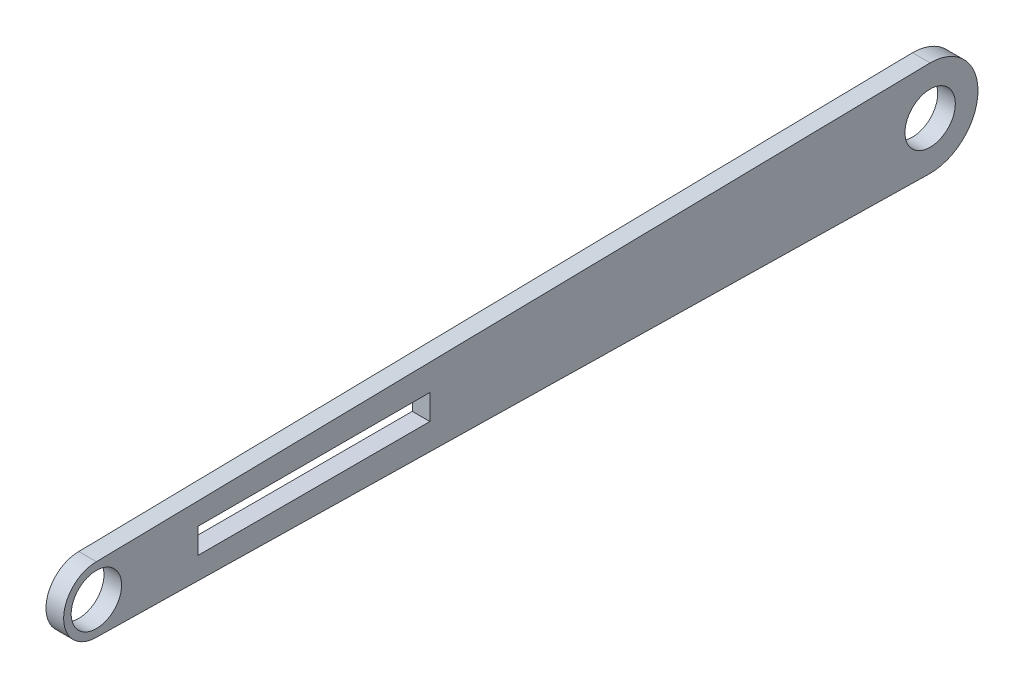
ISO-10303-21;
HEADER;
FILE_DESCRIPTION(('STEP AP214'),'2;1');
FILE_NAME('part.step','',(''),(''),'','','');
FILE_SCHEMA(('AUTOMOTIVE_DESIGN { 1 0 10303 214 1 1 1 1 }'));
ENDSEC;
DATA;
#1=APPLICATION_CONTEXT('core data for automotive mechanical design processes');
#2=APPLICATION_PROTOCOL_DEFINITION('international standard','automotive_design',2000,#1);
#3=PRODUCT_CONTEXT('',#1,'mechanical');
#4=PRODUCT('Part','Part','',(#3));
#5=PRODUCT_RELATED_PRODUCT_CATEGORY('part','',(#4));
#6=PRODUCT_DEFINITION_FORMATION('','',#4);
#7=PRODUCT_DEFINITION_CONTEXT('part definition',#1,'design');
#8=PRODUCT_DEFINITION('design','',#6,#7);
#9=PRODUCT_DEFINITION_SHAPE('','',#8);
#10=(LENGTH_UNIT() NAMED_UNIT(*) SI_UNIT(.MILLI.,.METRE.));
#11=(NAMED_UNIT(*) PLANE_ANGLE_UNIT() SI_UNIT($,.RADIAN.));
#12=(NAMED_UNIT(*) SI_UNIT($,.STERADIAN.) SOLID_ANGLE_UNIT());
#13=UNCERTAINTY_MEASURE_WITH_UNIT(LENGTH_MEASURE(1.E-05),#10,'distance_accuracy_value','');
#14=(GEOMETRIC_REPRESENTATION_CONTEXT(3) GLOBAL_UNCERTAINTY_ASSIGNED_CONTEXT((#13)) GLOBAL_UNIT_ASSIGNED_CONTEXT((#10,
#11,#12)) REPRESENTATION_CONTEXT('',''));
#15=CARTESIAN_POINT('',(0.,0.,0.));
#16=DIRECTION('',(0.,0.,1.));
#17=DIRECTION('',(1.,0.,0.));
#18=AXIS2_PLACEMENT_3D('',#15,#16,#17);
#19=CARTESIAN_POINT('',(0.35,-0.649786490506127,0.0117786070786609));
#20=DIRECTION('',(0.,-0.999835748438502,0.0181239108478279));
#21=DIRECTION('',(0.,-0.0181239108478279,-0.999835748438502));
#22=AXIS2_PLACEMENT_3D('',#19,#20,#21);
#23=PLANE('',#22);
#24=DIRECTION('',(0.,0.0181239108478279,0.999835748438502));
#25=VECTOR('',#24,1.);
#26=CARTESIAN_POINT('',(0.,-0.649786490506127,0.0117786070786609));
#27=LINE('',#26,#25);
#28=CARTESIAN_POINT('',(0.,-0.950000000000001,-16.55));
#29=VERTEX_POINT('',#28);
#30=CARTESIAN_POINT('',(0.,-0.65,0.));
#31=VERTEX_POINT('',#30);
#32=EDGE_CURVE('E148',#29,#31,#27,.T.);
#33=ORIENTED_EDGE('',*,*,#32,.F.);
#34=DIRECTION('',(-1.,0.,0.));
#35=VECTOR('',#34,1.);
#36=CARTESIAN_POINT('',(0.35,-0.950000000000001,-16.55));
#37=LINE('',#36,#35);
#38=CARTESIAN_POINT('',(0.35,-0.950000000000001,-16.55));
#39=VERTEX_POINT('',#38);
#40=EDGE_CURVE('E11',#39,#29,#37,.T.);
#41=ORIENTED_EDGE('',*,*,#40,.F.);
#42=DIRECTION('',(0.,0.0181239108478279,0.999835748438502));
#43=VECTOR('',#42,1.);
#44=CARTESIAN_POINT('',(0.35,-0.649786490506127,0.0117786070786609));
#45=LINE('',#44,#43);
#46=CARTESIAN_POINT('',(0.35,-0.65,0.));
#47=VERTEX_POINT('',#46);
#48=EDGE_CURVE('E113',#39,#47,#45,.T.);
#49=ORIENTED_EDGE('',*,*,#48,.T.);
#50=DIRECTION('',(-1.,0.,0.));
#51=VECTOR('',#50,1.);
#52=CARTESIAN_POINT('',(0.35,-0.65,0.));
#53=LINE('',#52,#51);
#54=EDGE_CURVE('E86',#47,#31,#53,.T.);
#55=ORIENTED_EDGE('',*,*,#54,.T.);
#56=EDGE_LOOP('',(#33,#41,#49,#55));
#57=FACE_BOUND('',#56,.T.);
#58=ADVANCED_FACE('F33',(#57),#23,.T.);
#59=CARTESIAN_POINT('',(0.35,0.,-16.55));
#60=DIRECTION('',(-1.,0.,0.));
#61=DIRECTION('',(0.,0.,1.));
#62=AXIS2_PLACEMENT_3D('',#59,#60,#61);
#63=CYLINDRICAL_SURFACE('',#62,0.950000000000001);
#64=CARTESIAN_POINT('',(0.,0.,-16.55));
#65=DIRECTION('',(1.,0.,0.));
#66=DIRECTION('',(0.,0.,-1.));
#67=AXIS2_PLACEMENT_3D('',#64,#65,#66);
#68=CIRCLE('',#67,0.950000000000001);
#69=CARTESIAN_POINT('',(0.,0.950000000000001,-16.55));
#70=VERTEX_POINT('',#69);
#71=EDGE_CURVE('E119',#29,#70,#68,.T.);
#72=ORIENTED_EDGE('',*,*,#71,.T.);
#73=DIRECTION('',(-1.,0.,0.));
#74=VECTOR('',#73,1.);
#75=CARTESIAN_POINT('',(0.35,0.950000000000001,-16.55));
#76=LINE('',#75,#74);
#77=CARTESIAN_POINT('',(0.35,0.950000000000001,-16.55));
#78=VERTEX_POINT('',#77);
#79=EDGE_CURVE('E43',#78,#70,#76,.T.);
#80=ORIENTED_EDGE('',*,*,#79,.F.);
#81=CARTESIAN_POINT('',(0.35,0.,-16.55));
#82=DIRECTION('',(1.,0.,0.));
#83=DIRECTION('',(0.,0.,-1.));
#84=AXIS2_PLACEMENT_3D('',#81,#82,#83);
#85=CIRCLE('',#84,0.950000000000001);
#86=EDGE_CURVE('E108',#39,#78,#85,.T.);
#87=ORIENTED_EDGE('',*,*,#86,.F.);
#88=ORIENTED_EDGE('',*,*,#40,.T.);
#89=EDGE_LOOP('',(#72,#80,#87,#88));
#90=FACE_BOUND('',#89,.T.);
#91=ADVANCED_FACE('F117',(#90),#63,.T.);
#92=CARTESIAN_POINT('',(0.35,0.649786490506127,0.0117786070786609));
#93=DIRECTION('',(0.,0.999835748438502,0.0181239108478279));
#94=DIRECTION('',(0.,-0.0181239108478279,0.999835748438502));
#95=AXIS2_PLACEMENT_3D('',#92,#93,#94);
#96=PLANE('',#95);
#97=DIRECTION('',(0.,0.0181239108478279,-0.999835748438502));
#98=VECTOR('',#97,1.);
#99=CARTESIAN_POINT('',(0.,0.649786490506127,0.0117786070786609));
#100=LINE('',#99,#98);
#101=CARTESIAN_POINT('',(0.,0.65,0.));
#102=VERTEX_POINT('',#101);
#103=EDGE_CURVE('E152',#102,#70,#100,.T.);
#104=ORIENTED_EDGE('',*,*,#103,.F.);
#105=DIRECTION('',(-1.,0.,0.));
#106=VECTOR('',#105,1.);
#107=CARTESIAN_POINT('',(0.35,0.65,0.));
#108=LINE('',#107,#106);
#109=CARTESIAN_POINT('',(0.35,0.65,0.));
#110=VERTEX_POINT('',#109);
#111=EDGE_CURVE('E79',#110,#102,#108,.T.);
#112=ORIENTED_EDGE('',*,*,#111,.F.);
#113=DIRECTION('',(0.,0.0181239108478279,-0.999835748438502));
#114=VECTOR('',#113,1.);
#115=CARTESIAN_POINT('',(0.35,0.649786490506127,0.0117786070786609));
#116=LINE('',#115,#114);
#117=EDGE_CURVE('E112',#110,#78,#116,.T.);
#118=ORIENTED_EDGE('',*,*,#117,.T.);
#119=ORIENTED_EDGE('',*,*,#79,.T.);
#120=EDGE_LOOP('',(#104,#112,#118,#119));
#121=FACE_BOUND('',#120,.T.);
#122=ADVANCED_FACE('F124',(#121),#96,.T.);
#123=CARTESIAN_POINT('',(0.35,0.25,0.));
#124=DIRECTION('',(0.,1.,0.));
#125=DIRECTION('',(0.,0.,1.));
#126=AXIS2_PLACEMENT_3D('',#123,#124,#125);
#127=PLANE('',#126);
#128=DIRECTION('',(0.,0.,-1.));
#129=VECTOR('',#128,1.);
#130=CARTESIAN_POINT('',(0.,0.25,0.));
#131=LINE('',#130,#129);
#132=CARTESIAN_POINT('',(0.,0.25,-2.02));
#133=VERTEX_POINT('',#132);
#134=CARTESIAN_POINT('',(0.,0.25,-6.62));
#135=VERTEX_POINT('',#134);
#136=EDGE_CURVE('E130',#133,#135,#131,.T.);
#137=ORIENTED_EDGE('',*,*,#136,.T.);
#138=DIRECTION('',(-1.,0.,0.));
#139=VECTOR('',#138,1.);
#140=CARTESIAN_POINT('',(0.35,0.25,-6.62));
#141=LINE('',#140,#139);
#142=CARTESIAN_POINT('',(0.35,0.25,-6.62));
#143=VERTEX_POINT('',#142);
#144=EDGE_CURVE('E37',#143,#135,#141,.T.);
#145=ORIENTED_EDGE('',*,*,#144,.F.);
#146=DIRECTION('',(0.,0.,-1.));
#147=VECTOR('',#146,1.);
#148=CARTESIAN_POINT('',(0.35,0.25,0.));
#149=LINE('',#148,#147);
#150=CARTESIAN_POINT('',(0.35,0.25,-2.02));
#151=VERTEX_POINT('',#150);
#152=EDGE_CURVE('E156',#151,#143,#149,.T.);
#153=ORIENTED_EDGE('',*,*,#152,.F.);
#154=DIRECTION('',(-1.,0.,0.));
#155=VECTOR('',#154,1.);
#156=CARTESIAN_POINT('',(0.35,0.25,-2.02));
#157=LINE('',#156,#155);
#158=EDGE_CURVE('E126',#151,#133,#157,.T.);
#159=ORIENTED_EDGE('',*,*,#158,.T.);
#160=EDGE_LOOP('',(#137,#145,#153,#159));
#161=FACE_BOUND('',#160,.T.);
#162=ADVANCED_FACE('F35',(#161),#127,.F.);
#163=CARTESIAN_POINT('',(0.35,0.,-6.62));
#164=DIRECTION('',(0.,0.,-1.));
#165=DIRECTION('',(-1.,0.,0.));
#166=AXIS2_PLACEMENT_3D('',#163,#164,#165);
#167=PLANE('',#166);
#168=DIRECTION('',(0.,-1.,0.));
#169=VECTOR('',#168,1.);
#170=CARTESIAN_POINT('',(0.,0.,-6.62));
#171=LINE('',#170,#169);
#172=CARTESIAN_POINT('',(0.,-0.25,-6.62));
#173=VERTEX_POINT('',#172);
#174=EDGE_CURVE('E133',#135,#173,#171,.T.);
#175=ORIENTED_EDGE('',*,*,#174,.T.);
#176=DIRECTION('',(-1.,0.,0.));
#177=VECTOR('',#176,1.);
#178=CARTESIAN_POINT('',(0.35,-0.25,-6.62));
#179=LINE('',#178,#177);
#180=CARTESIAN_POINT('',(0.35,-0.25,-6.62));
#181=VERTEX_POINT('',#180);
#182=EDGE_CURVE('E161',#181,#173,#179,.T.);
#183=ORIENTED_EDGE('',*,*,#182,.F.);
#184=DIRECTION('',(0.,-1.,0.));
#185=VECTOR('',#184,1.);
#186=CARTESIAN_POINT('',(0.35,0.,-6.62));
#187=LINE('',#186,#185);
#188=EDGE_CURVE('E94',#143,#181,#187,.T.);
#189=ORIENTED_EDGE('',*,*,#188,.F.);
#190=ORIENTED_EDGE('',*,*,#144,.T.);
#191=EDGE_LOOP('',(#175,#183,#189,#190));
#192=FACE_BOUND('',#191,.T.);
#193=ADVANCED_FACE('F166',(#192),#167,.F.);
#194=CARTESIAN_POINT('',(0.35,-0.25,0.));
#195=DIRECTION('',(0.,1.,0.));
#196=DIRECTION('',(0.,0.,1.));
#197=AXIS2_PLACEMENT_3D('',#194,#195,#196);
#198=PLANE('',#197);
#199=DIRECTION('',(0.,0.,-1.));
#200=VECTOR('',#199,1.);
#201=CARTESIAN_POINT('',(0.,-0.25,0.));
#202=LINE('',#201,#200);
#203=CARTESIAN_POINT('',(0.,-0.25,-2.02));
#204=VERTEX_POINT('',#203);
#205=EDGE_CURVE('E136',#204,#173,#202,.T.);
#206=ORIENTED_EDGE('',*,*,#205,.F.);
#207=DIRECTION('',(-1.,0.,0.));
#208=VECTOR('',#207,1.);
#209=CARTESIAN_POINT('',(0.35,-0.25,-2.02));
#210=LINE('',#209,#208);
#211=CARTESIAN_POINT('',(0.35,-0.25,-2.02));
#212=VERTEX_POINT('',#211);
#213=EDGE_CURVE('E160',#212,#204,#210,.T.);
#214=ORIENTED_EDGE('',*,*,#213,.F.);
#215=DIRECTION('',(0.,0.,-1.));
#216=VECTOR('',#215,1.);
#217=CARTESIAN_POINT('',(0.35,-0.25,0.));
#218=LINE('',#217,#216);
#219=EDGE_CURVE('E290',#212,#181,#218,.T.);
#220=ORIENTED_EDGE('',*,*,#219,.T.);
#221=ORIENTED_EDGE('',*,*,#182,.T.);
#222=EDGE_LOOP('',(#206,#214,#220,#221));
#223=FACE_BOUND('',#222,.T.);
#224=ADVANCED_FACE('F180',(#223),#198,.T.);
#225=CARTESIAN_POINT('',(0.35,0.,-16.55));
#226=DIRECTION('',(-1.,0.,0.));
#227=DIRECTION('',(0.,0.,1.));
#228=AXIS2_PLACEMENT_3D('',#225,#226,#227);
#229=CYLINDRICAL_SURFACE('',#228,0.499999999999999);
#230=CARTESIAN_POINT('',(0.35,0.,-16.55));
#231=DIRECTION('',(1.,0.,0.));
#232=DIRECTION('',(0.,0.,-1.));
#233=AXIS2_PLACEMENT_3D('',#230,#231,#232);
#234=CIRCLE('',#233,0.499999999999999);
#235=CARTESIAN_POINT('',(0.35,0.,-17.05));
#236=VERTEX_POINT('',#235);
#237=EDGE_CURVE('E282',#236,#236,#234,.T.);
#238=ORIENTED_EDGE('',*,*,#237,.T.);
#239=EDGE_LOOP('',(#238));
#240=FACE_BOUND('',#239,.T.);
#241=CARTESIAN_POINT('',(0.,0.,-16.55));
#242=DIRECTION('',(1.,0.,0.));
#243=DIRECTION('',(0.,0.,-1.));
#244=AXIS2_PLACEMENT_3D('',#241,#242,#243);
#245=CIRCLE('',#244,0.499999999999999);
#246=CARTESIAN_POINT('',(0.,0.,-17.05));
#247=VERTEX_POINT('',#246);
#248=EDGE_CURVE('E145',#247,#247,#245,.T.);
#249=ORIENTED_EDGE('',*,*,#248,.F.);
#250=EDGE_LOOP('',(#249));
#251=FACE_BOUND('',#250,.T.);
#252=ADVANCED_FACE('F182',(#240,#251),#229,.F.);
#253=CARTESIAN_POINT('',(0.35,0.,0.));
#254=DIRECTION('',(-1.,0.,0.));
#255=DIRECTION('',(0.,0.,1.));
#256=AXIS2_PLACEMENT_3D('',#253,#254,#255);
#257=CYLINDRICAL_SURFACE('',#256,0.5);
#258=CARTESIAN_POINT('',(0.35,0.,0.));
#259=DIRECTION('',(1.,0.,0.));
#260=DIRECTION('',(0.,0.,-1.));
#261=AXIS2_PLACEMENT_3D('',#258,#259,#260);
#262=CIRCLE('',#261,0.5);
#263=CARTESIAN_POINT('',(0.35,0.,-0.5));
#264=VERTEX_POINT('',#263);
#265=EDGE_CURVE('E284',#264,#264,#262,.T.);
#266=ORIENTED_EDGE('',*,*,#265,.T.);
#267=EDGE_LOOP('',(#266));
#268=FACE_BOUND('',#267,.T.);
#269=CARTESIAN_POINT('',(0.,0.,0.));
#270=DIRECTION('',(1.,0.,0.));
#271=DIRECTION('',(0.,0.,-1.));
#272=AXIS2_PLACEMENT_3D('',#269,#270,#271);
#273=CIRCLE('',#272,0.5);
#274=CARTESIAN_POINT('',(0.,0.,-0.5));
#275=VERTEX_POINT('',#274);
#276=EDGE_CURVE('E142',#275,#275,#273,.T.);
#277=ORIENTED_EDGE('',*,*,#276,.F.);
#278=EDGE_LOOP('',(#277));
#279=FACE_BOUND('',#278,.T.);
#280=ADVANCED_FACE('F188',(#268,#279),#257,.F.);
#281=CARTESIAN_POINT('',(0.35,0.,-2.02));
#282=DIRECTION('',(0.,0.,-1.));
#283=DIRECTION('',(-1.,0.,0.));
#284=AXIS2_PLACEMENT_3D('',#281,#282,#283);
#285=PLANE('',#284);
#286=DIRECTION('',(0.,-1.,0.));
#287=VECTOR('',#286,1.);
#288=CARTESIAN_POINT('',(0.,0.,-2.02));
#289=LINE('',#288,#287);
#290=EDGE_CURVE('E139',#133,#204,#289,.T.);
#291=ORIENTED_EDGE('',*,*,#290,.F.);
#292=ORIENTED_EDGE('',*,*,#158,.F.);
#293=DIRECTION('',(0.,-1.,0.));
#294=VECTOR('',#293,1.);
#295=CARTESIAN_POINT('',(0.35,0.,-2.02));
#296=LINE('',#295,#294);
#297=EDGE_CURVE('E178',#151,#212,#296,.T.);
#298=ORIENTED_EDGE('',*,*,#297,.T.);
#299=ORIENTED_EDGE('',*,*,#213,.T.);
#300=EDGE_LOOP('',(#291,#292,#298,#299));
#301=FACE_BOUND('',#300,.T.);
#302=ADVANCED_FACE('F175',(#301),#285,.T.);
#303=CARTESIAN_POINT('',(0.35,0.,0.));
#304=DIRECTION('',(-1.,0.,0.));
#305=DIRECTION('',(0.,0.,1.));
#306=AXIS2_PLACEMENT_3D('',#303,#304,#305);
#307=CYLINDRICAL_SURFACE('',#306,0.65);
#308=CARTESIAN_POINT('',(0.,0.,0.));
#309=DIRECTION('',(1.,0.,0.));
#310=DIRECTION('',(0.,0.,-1.));
#311=AXIS2_PLACEMENT_3D('',#308,#309,#310);
#312=CIRCLE('',#311,0.65);
#313=EDGE_CURVE('E154',#102,#31,#312,.T.);
#314=ORIENTED_EDGE('',*,*,#313,.T.);
#315=ORIENTED_EDGE('',*,*,#54,.F.);
#316=CARTESIAN_POINT('',(0.35,0.,0.));
#317=DIRECTION('',(1.,0.,0.));
#318=DIRECTION('',(0.,0.,-1.));
#319=AXIS2_PLACEMENT_3D('',#316,#317,#318);
#320=CIRCLE('',#319,0.65);
#321=EDGE_CURVE('E52',#110,#47,#320,.T.);
#322=ORIENTED_EDGE('',*,*,#321,.F.);
#323=ORIENTED_EDGE('',*,*,#111,.T.);
#324=EDGE_LOOP('',(#314,#315,#322,#323));
#325=FACE_BOUND('',#324,.T.);
#326=ADVANCED_FACE('F203',(#325),#307,.T.);
#327=CARTESIAN_POINT('',(0.35,0.,0.));
#328=DIRECTION('',(1.,0.,0.));
#329=DIRECTION('',(0.,0.,-1.));
#330=AXIS2_PLACEMENT_3D('',#327,#328,#329);
#331=PLANE('',#330);
#332=ORIENTED_EDGE('',*,*,#152,.T.);
#333=ORIENTED_EDGE('',*,*,#188,.T.);
#334=ORIENTED_EDGE('',*,*,#219,.F.);
#335=ORIENTED_EDGE('',*,*,#297,.F.);
#336=EDGE_LOOP('',(#332,#333,#334,#335));
#337=FACE_BOUND('',#336,.T.);
#338=ORIENTED_EDGE('',*,*,#265,.F.);
#339=EDGE_LOOP('',(#338));
#340=FACE_BOUND('',#339,.T.);
#341=ORIENTED_EDGE('',*,*,#237,.F.);
#342=EDGE_LOOP('',(#341));
#343=FACE_BOUND('',#342,.T.);
#344=ORIENTED_EDGE('',*,*,#48,.F.);
#345=ORIENTED_EDGE('',*,*,#86,.T.);
#346=ORIENTED_EDGE('',*,*,#117,.F.);
#347=ORIENTED_EDGE('',*,*,#321,.T.);
#348=EDGE_LOOP('',(#344,#345,#346,#347));
#349=FACE_BOUND('',#348,.T.);
#350=ADVANCED_FACE('F110',(#337,#340,#343,#349),#331,.T.);
#351=CARTESIAN_POINT('',(0.,0.,0.));
#352=DIRECTION('',(1.,0.,0.));
#353=DIRECTION('',(0.,0.,-1.));
#354=AXIS2_PLACEMENT_3D('',#351,#352,#353);
#355=PLANE('',#354);
#356=ORIENTED_EDGE('',*,*,#136,.F.);
#357=ORIENTED_EDGE('',*,*,#290,.T.);
#358=ORIENTED_EDGE('',*,*,#205,.T.);
#359=ORIENTED_EDGE('',*,*,#174,.F.);
#360=EDGE_LOOP('',(#356,#357,#358,#359));
#361=FACE_BOUND('',#360,.T.);
#362=ORIENTED_EDGE('',*,*,#276,.T.);
#363=EDGE_LOOP('',(#362));
#364=FACE_BOUND('',#363,.T.);
#365=ORIENTED_EDGE('',*,*,#248,.T.);
#366=EDGE_LOOP('',(#365));
#367=FACE_BOUND('',#366,.T.);
#368=ORIENTED_EDGE('',*,*,#32,.T.);
#369=ORIENTED_EDGE('',*,*,#313,.F.);
#370=ORIENTED_EDGE('',*,*,#103,.T.);
#371=ORIENTED_EDGE('',*,*,#71,.F.);
#372=EDGE_LOOP('',(#368,#369,#370,#371));
#373=FACE_BOUND('',#372,.T.);
#374=ADVANCED_FACE('F172',(#361,#364,#367,#373),#355,.F.);
#375=CLOSED_SHELL('',(#58,#91,#122,#162,#193,#224,#252,#280,#302,#326,#350,#374));
#376=MANIFOLD_SOLID_BREP('B2',#375);
#377=ADVANCED_BREP_SHAPE_REPRESENTATION('',(#18,#376),#14);
#378=SHAPE_DEFINITION_REPRESENTATION(#9,#377);
ENDSEC;
END-ISO-10303-21;
